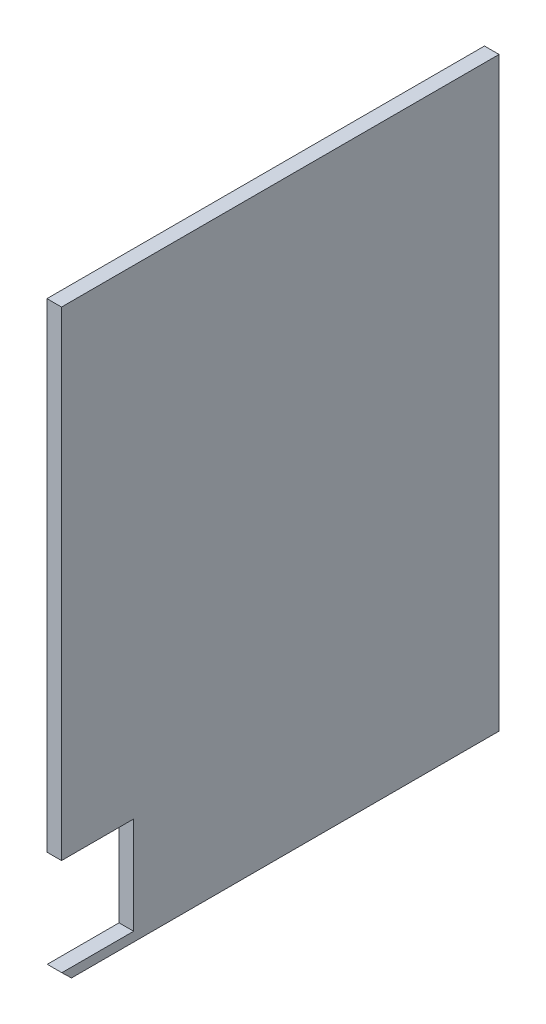
ISO-10303-21;
HEADER;
FILE_DESCRIPTION(('STEP AP214'),'2;1');
FILE_NAME('part.step','',(''),(''),'','','');
FILE_SCHEMA(('AUTOMOTIVE_DESIGN { 1 0 10303 214 1 1 1 1 }'));
ENDSEC;
DATA;
#1=APPLICATION_CONTEXT('core data for automotive mechanical design processes');
#2=APPLICATION_PROTOCOL_DEFINITION('international standard','automotive_design',2000,#1);
#3=PRODUCT_CONTEXT('',#1,'mechanical');
#4=PRODUCT('Part','Part','',(#3));
#5=PRODUCT_RELATED_PRODUCT_CATEGORY('part','',(#4));
#6=PRODUCT_DEFINITION_FORMATION('','',#4);
#7=PRODUCT_DEFINITION_CONTEXT('part definition',#1,'design');
#8=PRODUCT_DEFINITION('design','',#6,#7);
#9=PRODUCT_DEFINITION_SHAPE('','',#8);
#10=(LENGTH_UNIT() NAMED_UNIT(*) SI_UNIT(.MILLI.,.METRE.));
#11=(NAMED_UNIT(*) PLANE_ANGLE_UNIT() SI_UNIT($,.RADIAN.));
#12=(NAMED_UNIT(*) SI_UNIT($,.STERADIAN.) SOLID_ANGLE_UNIT());
#13=UNCERTAINTY_MEASURE_WITH_UNIT(LENGTH_MEASURE(1.E-05),#10,'distance_accuracy_value','');
#14=(GEOMETRIC_REPRESENTATION_CONTEXT(3) GLOBAL_UNCERTAINTY_ASSIGNED_CONTEXT((#13)) GLOBAL_UNIT_ASSIGNED_CONTEXT((#10,
#11,#12)) REPRESENTATION_CONTEXT('',''));
#15=CARTESIAN_POINT('',(0.,0.,0.));
#16=DIRECTION('',(0.,0.,1.));
#17=DIRECTION('',(1.,0.,0.));
#18=AXIS2_PLACEMENT_3D('',#15,#16,#17);
#19=CARTESIAN_POINT('',(6.,14.4208170736232,475.450700314675));
#20=DIRECTION('',(0.,1.,0.));
#21=DIRECTION('',(0.,0.,1.));
#22=AXIS2_PLACEMENT_3D('',#19,#20,#21);
#23=PLANE('',#22);
#24=DIRECTION('',(0.,0.,-1.));
#25=VECTOR('',#24,1.);
#26=CARTESIAN_POINT('',(0.,14.4208170736232,475.450700314675));
#27=LINE('',#26,#25);
#28=CARTESIAN_POINT('',(0.,14.4208170736232,505.119316824085));
#29=VERTEX_POINT('',#28);
#30=CARTESIAN_POINT('',(0.,14.4208170736232,475.450700314675));
#31=VERTEX_POINT('',#30);
#32=EDGE_CURVE('E139',#29,#31,#27,.T.);
#33=ORIENTED_EDGE('',*,*,#32,.T.);
#34=DIRECTION('',(-1.,0.,0.));
#35=VECTOR('',#34,1.);
#36=CARTESIAN_POINT('',(6.,14.4208170736232,475.450700314675));
#37=LINE('',#36,#35);
#38=CARTESIAN_POINT('',(6.,14.4208170736232,475.450700314675));
#39=VERTEX_POINT('',#38);
#40=EDGE_CURVE('E47',#39,#31,#37,.T.);
#41=ORIENTED_EDGE('',*,*,#40,.F.);
#42=DIRECTION('',(0.,0.,-1.));
#43=VECTOR('',#42,1.);
#44=CARTESIAN_POINT('',(6.,14.4208170736232,475.450700314675));
#45=LINE('',#44,#43);
#46=CARTESIAN_POINT('',(6.,14.4208170736232,505.119316824085));
#47=VERTEX_POINT('',#46);
#48=EDGE_CURVE('E99',#47,#39,#45,.T.);
#49=ORIENTED_EDGE('',*,*,#48,.F.);
#50=DIRECTION('',(-1.,0.,0.));
#51=VECTOR('',#50,1.);
#52=CARTESIAN_POINT('',(6.,14.4208170736232,505.119316824085));
#53=LINE('',#52,#51);
#54=EDGE_CURVE('E11',#47,#29,#53,.T.);
#55=ORIENTED_EDGE('',*,*,#54,.T.);
#56=EDGE_LOOP('',(#33,#41,#49,#55));
#57=FACE_BOUND('',#56,.T.);
#58=ADVANCED_FACE('F39',(#57),#23,.F.);
#59=CARTESIAN_POINT('',(6.,-25.5791829263768,475.450700314675));
#60=DIRECTION('',(0.,0.,-1.));
#61=DIRECTION('',(-1.,0.,0.));
#62=AXIS2_PLACEMENT_3D('',#59,#60,#61);
#63=PLANE('',#62);
#64=DIRECTION('',(0.,-1.,0.));
#65=VECTOR('',#64,1.);
#66=CARTESIAN_POINT('',(0.,-25.5791829263768,475.450700314675));
#67=LINE('',#66,#65);
#68=CARTESIAN_POINT('',(0.,-25.5791829263768,475.450700314675));
#69=VERTEX_POINT('',#68);
#70=EDGE_CURVE('E141',#31,#69,#67,.T.);
#71=ORIENTED_EDGE('',*,*,#70,.T.);
#72=DIRECTION('',(-1.,0.,0.));
#73=VECTOR('',#72,1.);
#74=CARTESIAN_POINT('',(6.,-25.5791829263768,475.450700314675));
#75=LINE('',#74,#73);
#76=CARTESIAN_POINT('',(6.,-25.5791829263768,475.450700314675));
#77=VERTEX_POINT('',#76);
#78=EDGE_CURVE('E158',#77,#69,#75,.T.);
#79=ORIENTED_EDGE('',*,*,#78,.F.);
#80=DIRECTION('',(0.,-1.,0.));
#81=VECTOR('',#80,1.);
#82=CARTESIAN_POINT('',(6.,-25.5791829263768,475.450700314675));
#83=LINE('',#82,#81);
#84=EDGE_CURVE('E166',#39,#77,#83,.T.);
#85=ORIENTED_EDGE('',*,*,#84,.F.);
#86=ORIENTED_EDGE('',*,*,#40,.T.);
#87=EDGE_LOOP('',(#71,#79,#85,#86));
#88=FACE_BOUND('',#87,.T.);
#89=ADVANCED_FACE('F164',(#88),#63,.F.);
#90=CARTESIAN_POINT('',(6.,-25.5791829263768,504.989741781757));
#91=DIRECTION('',(0.,-1.,0.));
#92=DIRECTION('',(0.,0.,-1.));
#93=AXIS2_PLACEMENT_3D('',#90,#91,#92);
#94=PLANE('',#93);
#95=DIRECTION('',(0.,0.,1.));
#96=VECTOR('',#95,1.);
#97=CARTESIAN_POINT('',(0.,-25.5791829263768,504.989741781757));
#98=LINE('',#97,#96);
#99=CARTESIAN_POINT('',(0.,-25.5791829263768,504.989741781757));
#100=VERTEX_POINT('',#99);
#101=EDGE_CURVE('E143',#69,#100,#98,.T.);
#102=ORIENTED_EDGE('',*,*,#101,.T.);
#103=DIRECTION('',(-1.,0.,0.));
#104=VECTOR('',#103,1.);
#105=CARTESIAN_POINT('',(6.,-25.5791829263768,504.989741781757));
#106=LINE('',#105,#104);
#107=CARTESIAN_POINT('',(6.,-25.5791829263768,504.989741781757));
#108=VERTEX_POINT('',#107);
#109=EDGE_CURVE('E155',#108,#100,#106,.T.);
#110=ORIENTED_EDGE('',*,*,#109,.F.);
#111=DIRECTION('',(0.,0.,1.));
#112=VECTOR('',#111,1.);
#113=CARTESIAN_POINT('',(6.,-25.5791829263768,504.989741781757));
#114=LINE('',#113,#112);
#115=EDGE_CURVE('E179',#77,#108,#114,.T.);
#116=ORIENTED_EDGE('',*,*,#115,.F.);
#117=ORIENTED_EDGE('',*,*,#78,.T.);
#118=EDGE_LOOP('',(#102,#110,#116,#117));
#119=FACE_BOUND('',#118,.T.);
#120=ADVANCED_FACE('F175',(#119),#94,.F.);
#121=CARTESIAN_POINT('',(6.,-29.4443809176548,501.026117873451));
#122=DIRECTION('',(0.,0.715940126349568,-0.69816168290917));
#123=DIRECTION('',(0.,0.69816168290917,0.715940126349568));
#124=AXIS2_PLACEMENT_3D('',#121,#122,#123);
#125=PLANE('',#124);
#126=DIRECTION('',(0.,-0.69816168290917,-0.715940126349568));
#127=VECTOR('',#126,1.);
#128=CARTESIAN_POINT('',(0.,-29.4443809176548,501.026117873451));
#129=LINE('',#128,#127);
#130=CARTESIAN_POINT('',(0.,-29.4443809176548,501.026117873451));
#131=VERTEX_POINT('',#130);
#132=EDGE_CURVE('E145',#100,#131,#129,.T.);
#133=ORIENTED_EDGE('',*,*,#132,.T.);
#134=DIRECTION('',(-1.,0.,0.));
#135=VECTOR('',#134,1.);
#136=CARTESIAN_POINT('',(6.,-29.4443809176548,501.026117873451));
#137=LINE('',#136,#135);
#138=CARTESIAN_POINT('',(6.,-29.4443809176548,501.026117873451));
#139=VERTEX_POINT('',#138);
#140=EDGE_CURVE('E128',#139,#131,#137,.T.);
#141=ORIENTED_EDGE('',*,*,#140,.F.);
#142=DIRECTION('',(0.,-0.69816168290917,-0.715940126349568));
#143=VECTOR('',#142,1.);
#144=CARTESIAN_POINT('',(6.,-29.4443809176548,501.026117873451));
#145=LINE('',#144,#143);
#146=EDGE_CURVE('E119',#108,#139,#145,.T.);
#147=ORIENTED_EDGE('',*,*,#146,.F.);
#148=ORIENTED_EDGE('',*,*,#109,.T.);
#149=EDGE_LOOP('',(#133,#141,#147,#148));
#150=FACE_BOUND('',#149,.T.);
#151=ADVANCED_FACE('F178',(#150),#125,.F.);
#152=CARTESIAN_POINT('',(6.,-29.4443809176548,325.119316824085));
#153=DIRECTION('',(0.,1.,0.));
#154=DIRECTION('',(0.,0.,1.));
#155=AXIS2_PLACEMENT_3D('',#152,#153,#154);
#156=PLANE('',#155);
#157=DIRECTION('',(0.,0.,-1.));
#158=VECTOR('',#157,1.);
#159=CARTESIAN_POINT('',(0.,-29.4443809176548,325.119316824085));
#160=LINE('',#159,#158);
#161=CARTESIAN_POINT('',(0.,-29.4443809176548,325.119316824085));
#162=VERTEX_POINT('',#161);
#163=EDGE_CURVE('E127',#131,#162,#160,.T.);
#164=ORIENTED_EDGE('',*,*,#163,.T.);
#165=DIRECTION('',(-1.,0.,0.));
#166=VECTOR('',#165,1.);
#167=CARTESIAN_POINT('',(6.,-29.4443809176548,325.119316824085));
#168=LINE('',#167,#166);
#169=CARTESIAN_POINT('',(6.,-29.4443809176548,325.119316824085));
#170=VERTEX_POINT('',#169);
#171=EDGE_CURVE('E124',#170,#162,#168,.T.);
#172=ORIENTED_EDGE('',*,*,#171,.F.);
#173=DIRECTION('',(0.,0.,-1.));
#174=VECTOR('',#173,1.);
#175=CARTESIAN_POINT('',(6.,-29.4443809176548,325.119316824085));
#176=LINE('',#175,#174);
#177=EDGE_CURVE('E113',#139,#170,#176,.T.);
#178=ORIENTED_EDGE('',*,*,#177,.F.);
#179=ORIENTED_EDGE('',*,*,#140,.T.);
#180=EDGE_LOOP('',(#164,#172,#178,#179));
#181=FACE_BOUND('',#180,.T.);
#182=ADVANCED_FACE('F125',(#181),#156,.F.);
#183=CARTESIAN_POINT('',(6.,-29.4443809176548,325.119316824085));
#184=DIRECTION('',(0.,0.,1.));
#185=DIRECTION('',(1.,0.,0.));
#186=AXIS2_PLACEMENT_3D('',#183,#184,#185);
#187=PLANE('',#186);
#188=DIRECTION('',(0.,1.,0.));
#189=VECTOR('',#188,1.);
#190=CARTESIAN_POINT('',(0.,-29.4443809176548,325.119316824085));
#191=LINE('',#190,#189);
#192=CARTESIAN_POINT('',(0.,211.645247630343,325.119316824085));
#193=VERTEX_POINT('',#192);
#194=EDGE_CURVE('E85',#162,#193,#191,.T.);
#195=ORIENTED_EDGE('',*,*,#194,.T.);
#196=DIRECTION('',(-1.,0.,0.));
#197=VECTOR('',#196,1.);
#198=CARTESIAN_POINT('',(6.,211.645247630343,325.119316824085));
#199=LINE('',#198,#197);
#200=CARTESIAN_POINT('',(6.,211.645247630343,325.119316824085));
#201=VERTEX_POINT('',#200);
#202=EDGE_CURVE('E129',#201,#193,#199,.T.);
#203=ORIENTED_EDGE('',*,*,#202,.F.);
#204=DIRECTION('',(0.,1.,0.));
#205=VECTOR('',#204,1.);
#206=CARTESIAN_POINT('',(6.,-29.4443809176548,325.119316824085));
#207=LINE('',#206,#205);
#208=EDGE_CURVE('E117',#170,#201,#207,.T.);
#209=ORIENTED_EDGE('',*,*,#208,.F.);
#210=ORIENTED_EDGE('',*,*,#171,.T.);
#211=EDGE_LOOP('',(#195,#203,#209,#210));
#212=FACE_BOUND('',#211,.T.);
#213=ADVANCED_FACE('F131',(#212),#187,.F.);
#214=CARTESIAN_POINT('',(6.,211.645247630343,505.119316824085));
#215=DIRECTION('',(0.,-1.,0.));
#216=DIRECTION('',(0.,0.,-1.));
#217=AXIS2_PLACEMENT_3D('',#214,#215,#216);
#218=PLANE('',#217);
#219=DIRECTION('',(0.,0.,1.));
#220=VECTOR('',#219,1.);
#221=CARTESIAN_POINT('',(0.,211.645247630343,505.119316824085));
#222=LINE('',#221,#220);
#223=CARTESIAN_POINT('',(0.,211.645247630343,505.119316824085));
#224=VERTEX_POINT('',#223);
#225=EDGE_CURVE('E92',#193,#224,#222,.T.);
#226=ORIENTED_EDGE('',*,*,#225,.T.);
#227=DIRECTION('',(-1.,0.,0.));
#228=VECTOR('',#227,1.);
#229=CARTESIAN_POINT('',(6.,211.645247630343,505.119316824085));
#230=LINE('',#229,#228);
#231=CARTESIAN_POINT('',(6.,211.645247630343,505.119316824085));
#232=VERTEX_POINT('',#231);
#233=EDGE_CURVE('E135',#232,#224,#230,.T.);
#234=ORIENTED_EDGE('',*,*,#233,.F.);
#235=DIRECTION('',(0.,0.,1.));
#236=VECTOR('',#235,1.);
#237=CARTESIAN_POINT('',(6.,211.645247630343,505.119316824085));
#238=LINE('',#237,#236);
#239=EDGE_CURVE('E133',#201,#232,#238,.T.);
#240=ORIENTED_EDGE('',*,*,#239,.F.);
#241=ORIENTED_EDGE('',*,*,#202,.T.);
#242=EDGE_LOOP('',(#226,#234,#240,#241));
#243=FACE_BOUND('',#242,.T.);
#244=ADVANCED_FACE('F200',(#243),#218,.F.);
#245=CARTESIAN_POINT('',(6.,150.999999999982,505.119316824085));
#246=DIRECTION('',(0.,0.,-1.));
#247=DIRECTION('',(-1.,0.,0.));
#248=AXIS2_PLACEMENT_3D('',#245,#246,#247);
#249=PLANE('',#248);
#250=DIRECTION('',(0.,-1.,0.));
#251=VECTOR('',#250,1.);
#252=CARTESIAN_POINT('',(0.,150.999999999982,505.119316824085));
#253=LINE('',#252,#251);
#254=EDGE_CURVE('E150',#224,#29,#253,.T.);
#255=ORIENTED_EDGE('',*,*,#254,.T.);
#256=ORIENTED_EDGE('',*,*,#54,.F.);
#257=DIRECTION('',(0.,-1.,0.));
#258=VECTOR('',#257,1.);
#259=CARTESIAN_POINT('',(6.,14.4208170736232,505.119316824085));
#260=LINE('',#259,#258);
#261=EDGE_CURVE('E55',#232,#47,#260,.T.);
#262=ORIENTED_EDGE('',*,*,#261,.F.);
#263=ORIENTED_EDGE('',*,*,#233,.T.);
#264=EDGE_LOOP('',(#255,#256,#262,#263));
#265=FACE_BOUND('',#264,.T.);
#266=ADVANCED_FACE('F184',(#265),#249,.F.);
#267=CARTESIAN_POINT('',(6.,0.,0.));
#268=DIRECTION('',(-1.,0.,0.));
#269=DIRECTION('',(0.,0.,1.));
#270=AXIS2_PLACEMENT_3D('',#267,#268,#269);
#271=PLANE('',#270);
#272=ORIENTED_EDGE('',*,*,#261,.T.);
#273=ORIENTED_EDGE('',*,*,#48,.T.);
#274=ORIENTED_EDGE('',*,*,#84,.T.);
#275=ORIENTED_EDGE('',*,*,#115,.T.);
#276=ORIENTED_EDGE('',*,*,#146,.T.);
#277=ORIENTED_EDGE('',*,*,#177,.T.);
#278=ORIENTED_EDGE('',*,*,#208,.T.);
#279=ORIENTED_EDGE('',*,*,#239,.T.);
#280=EDGE_LOOP('',(#272,#273,#274,#275,#276,#277,#278,#279));
#281=FACE_BOUND('',#280,.T.);
#282=ADVANCED_FACE('F115',(#281),#271,.F.);
#283=CARTESIAN_POINT('',(0.,0.,0.));
#284=DIRECTION('',(-1.,0.,0.));
#285=DIRECTION('',(0.,0.,1.));
#286=AXIS2_PLACEMENT_3D('',#283,#284,#285);
#287=PLANE('',#286);
#288=ORIENTED_EDGE('',*,*,#32,.F.);
#289=ORIENTED_EDGE('',*,*,#254,.F.);
#290=ORIENTED_EDGE('',*,*,#225,.F.);
#291=ORIENTED_EDGE('',*,*,#194,.F.);
#292=ORIENTED_EDGE('',*,*,#163,.F.);
#293=ORIENTED_EDGE('',*,*,#132,.F.);
#294=ORIENTED_EDGE('',*,*,#101,.F.);
#295=ORIENTED_EDGE('',*,*,#70,.F.);
#296=EDGE_LOOP('',(#288,#289,#290,#291,#292,#293,#294,#295));
#297=FACE_BOUND('',#296,.T.);
#298=ADVANCED_FACE('F170',(#297),#287,.T.);
#299=CLOSED_SHELL('',(#58,#89,#120,#151,#182,#213,#244,#266,#282,#298));
#300=MANIFOLD_SOLID_BREP('B2',#299);
#301=ADVANCED_BREP_SHAPE_REPRESENTATION('',(#18,#300),#14);
#302=SHAPE_DEFINITION_REPRESENTATION(#9,#301);
ENDSEC;
END-ISO-10303-21;
